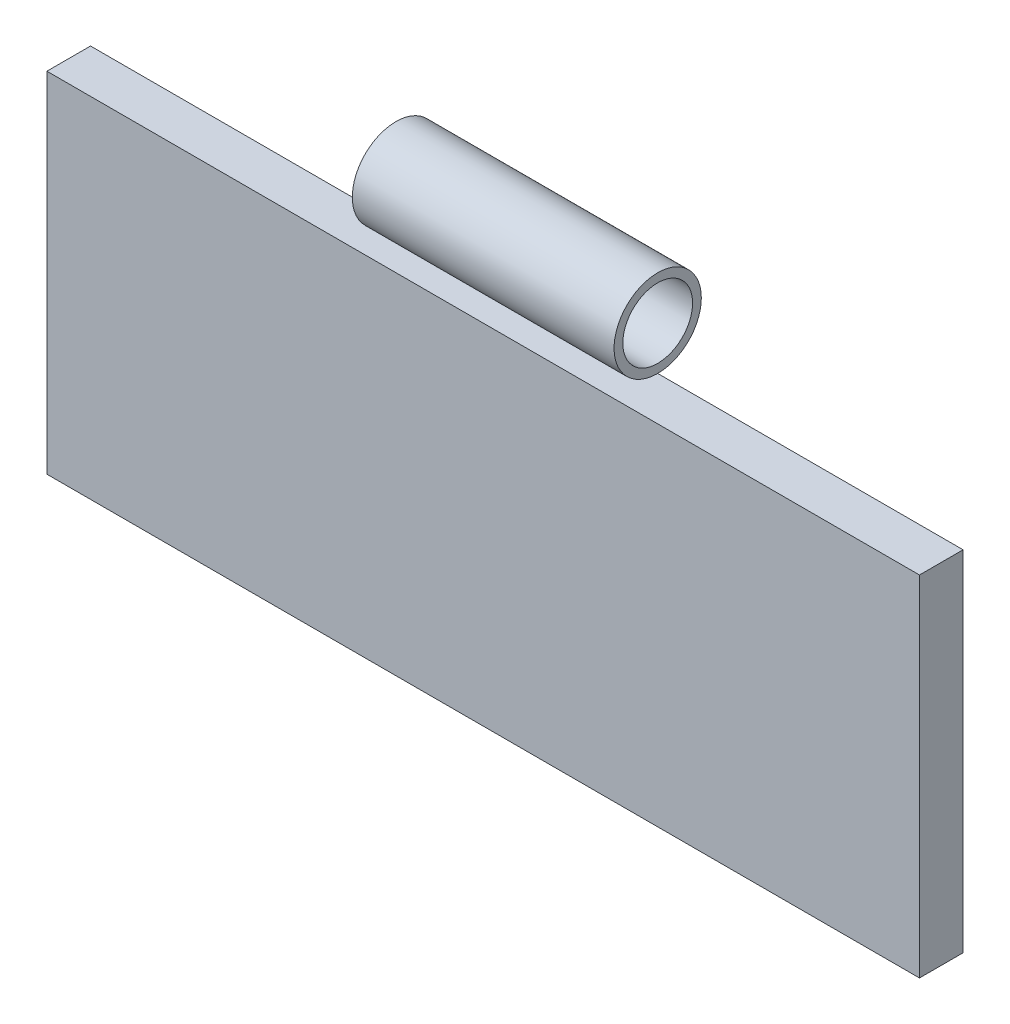
ISO-10303-21;
HEADER;
FILE_DESCRIPTION(('STEP AP214'),'2;1');
FILE_NAME('part.step','',(''),(''),'','','');
FILE_SCHEMA(('AUTOMOTIVE_DESIGN { 1 0 10303 214 1 1 1 1 }'));
ENDSEC;
DATA;
#1=APPLICATION_CONTEXT('core data for automotive mechanical design processes');
#2=APPLICATION_PROTOCOL_DEFINITION('international standard','automotive_design',2000,#1);
#3=PRODUCT_CONTEXT('',#1,'mechanical');
#4=PRODUCT('Part','Part','',(#3));
#5=PRODUCT_RELATED_PRODUCT_CATEGORY('part','',(#4));
#6=PRODUCT_DEFINITION_FORMATION('','',#4);
#7=PRODUCT_DEFINITION_CONTEXT('part definition',#1,'design');
#8=PRODUCT_DEFINITION('design','',#6,#7);
#9=PRODUCT_DEFINITION_SHAPE('','',#8);
#10=(LENGTH_UNIT() NAMED_UNIT(*) SI_UNIT(.MILLI.,.METRE.));
#11=(NAMED_UNIT(*) PLANE_ANGLE_UNIT() SI_UNIT($,.RADIAN.));
#12=(NAMED_UNIT(*) SI_UNIT($,.STERADIAN.) SOLID_ANGLE_UNIT());
#13=UNCERTAINTY_MEASURE_WITH_UNIT(LENGTH_MEASURE(1.E-05),#10,'distance_accuracy_value','');
#14=(GEOMETRIC_REPRESENTATION_CONTEXT(3) GLOBAL_UNCERTAINTY_ASSIGNED_CONTEXT((#13)) GLOBAL_UNIT_ASSIGNED_CONTEXT((#10,
#11,#12)) REPRESENTATION_CONTEXT('',''));
#15=CARTESIAN_POINT('',(0.,0.,0.));
#16=DIRECTION('',(0.,0.,1.));
#17=DIRECTION('',(1.,0.,0.));
#18=AXIS2_PLACEMENT_3D('',#15,#16,#17);
#19=CARTESIAN_POINT('',(15.,25.,0.));
#20=DIRECTION('',(1.,0.,0.));
#21=DIRECTION('',(0.,0.,-1.));
#22=AXIS2_PLACEMENT_3D('',#19,#20,#21);
#23=CYLINDRICAL_SURFACE('',#22,5.);
#24=CARTESIAN_POINT('',(-15.,25.,0.));
#25=DIRECTION('',(1.,0.,0.));
#26=DIRECTION('',(0.,0.,-1.));
#27=AXIS2_PLACEMENT_3D('',#24,#25,#26);
#28=CIRCLE('',#27,5.);
#29=CARTESIAN_POINT('',(-15.,25.,-5.));
#30=VERTEX_POINT('',#29);
#31=EDGE_CURVE('E49',#30,#30,#28,.T.);
#32=ORIENTED_EDGE('',*,*,#31,.T.);
#33=EDGE_LOOP('',(#32));
#34=FACE_BOUND('',#33,.T.);
#35=CARTESIAN_POINT('',(15.,25.,0.));
#36=DIRECTION('',(1.,0.,0.));
#37=DIRECTION('',(0.,0.,-1.));
#38=AXIS2_PLACEMENT_3D('',#35,#36,#37);
#39=CIRCLE('',#38,5.);
#40=CARTESIAN_POINT('',(15.,25.,-5.));
#41=VERTEX_POINT('',#40);
#42=EDGE_CURVE('E11',#41,#41,#39,.T.);
#43=ORIENTED_EDGE('',*,*,#42,.F.);
#44=EDGE_LOOP('',(#43));
#45=FACE_BOUND('',#44,.T.);
#46=ADVANCED_FACE('F43',(#34,#45),#23,.T.);
#47=CARTESIAN_POINT('',(15.,20.,0.));
#48=DIRECTION('',(-1.,0.,0.));
#49=DIRECTION('',(0.,0.,1.));
#50=AXIS2_PLACEMENT_3D('',#47,#48,#49);
#51=PLANE('',#50);
#52=CARTESIAN_POINT('',(15.,25.,0.));
#53=DIRECTION('',(-1.,0.,0.));
#54=DIRECTION('',(0.,0.,1.));
#55=AXIS2_PLACEMENT_3D('',#52,#53,#54);
#56=CIRCLE('',#55,4.);
#57=CARTESIAN_POINT('',(15.,25.,4.));
#58=VERTEX_POINT('',#57);
#59=EDGE_CURVE('E53',#58,#58,#56,.F.);
#60=ORIENTED_EDGE('',*,*,#59,.F.);
#61=EDGE_LOOP('',(#60));
#62=FACE_BOUND('',#61,.T.);
#63=ORIENTED_EDGE('',*,*,#42,.T.);
#64=EDGE_LOOP('',(#63));
#65=FACE_BOUND('',#64,.T.);
#66=ADVANCED_FACE('F69',(#62,#65),#51,.F.);
#67=CARTESIAN_POINT('',(-15.,25.,0.));
#68=DIRECTION('',(1.,0.,0.));
#69=DIRECTION('',(0.,0.,-1.));
#70=AXIS2_PLACEMENT_3D('',#67,#68,#69);
#71=PLANE('',#70);
#72=CARTESIAN_POINT('',(-15.,25.,0.));
#73=DIRECTION('',(-1.,0.,0.));
#74=DIRECTION('',(0.,0.,1.));
#75=AXIS2_PLACEMENT_3D('',#72,#73,#74);
#76=CIRCLE('',#75,4.);
#77=CARTESIAN_POINT('',(-15.,25.,4.));
#78=VERTEX_POINT('',#77);
#79=EDGE_CURVE('E57',#78,#78,#76,.T.);
#80=ORIENTED_EDGE('',*,*,#79,.F.);
#81=EDGE_LOOP('',(#80));
#82=FACE_BOUND('',#81,.T.);
#83=ORIENTED_EDGE('',*,*,#31,.F.);
#84=EDGE_LOOP('',(#83));
#85=FACE_BOUND('',#84,.T.);
#86=ADVANCED_FACE('F66',(#82,#85),#71,.F.);
#87=CARTESIAN_POINT('',(50.001,25.,0.));
#88=DIRECTION('',(-1.,0.,0.));
#89=DIRECTION('',(0.,0.,1.));
#90=AXIS2_PLACEMENT_3D('',#87,#88,#89);
#91=CYLINDRICAL_SURFACE('',#90,4.);
#92=ORIENTED_EDGE('',*,*,#79,.T.);
#93=EDGE_LOOP('',(#92));
#94=FACE_BOUND('',#93,.T.);
#95=ORIENTED_EDGE('',*,*,#59,.T.);
#96=EDGE_LOOP('',(#95));
#97=FACE_BOUND('',#96,.T.);
#98=ADVANCED_FACE('F63',(#94,#97),#91,.F.);
#99=CLOSED_SHELL('',(#46,#66,#86,#98));
#100=MANIFOLD_SOLID_BREP('B2',#99);
#101=CARTESIAN_POINT('',(50.,20.,5.));
#102=DIRECTION('',(-1.,0.,0.));
#103=DIRECTION('',(0.,0.,1.));
#104=AXIS2_PLACEMENT_3D('',#101,#102,#103);
#105=PLANE('',#104);
#106=DIRECTION('',(0.,1.,0.));
#107=VECTOR('',#106,1.);
#108=CARTESIAN_POINT('',(50.,20.,0.));
#109=LINE('',#108,#107);
#110=CARTESIAN_POINT('',(50.,-20.,0.));
#111=VERTEX_POINT('',#110);
#112=CARTESIAN_POINT('',(50.,20.,0.));
#113=VERTEX_POINT('',#112);
#114=EDGE_CURVE('E168',#111,#113,#109,.T.);
#115=ORIENTED_EDGE('',*,*,#114,.T.);
#116=DIRECTION('',(0.,0.,-1.));
#117=VECTOR('',#116,1.);
#118=CARTESIAN_POINT('',(50.,20.,5.));
#119=LINE('',#118,#117);
#120=CARTESIAN_POINT('',(50.,20.,5.));
#121=VERTEX_POINT('',#120);
#122=EDGE_CURVE('E41',#121,#113,#119,.T.);
#123=ORIENTED_EDGE('',*,*,#122,.F.);
#124=DIRECTION('',(0.,1.,0.));
#125=VECTOR('',#124,1.);
#126=CARTESIAN_POINT('',(50.,20.,5.));
#127=LINE('',#126,#125);
#128=CARTESIAN_POINT('',(50.,-20.,5.));
#129=VERTEX_POINT('',#128);
#130=EDGE_CURVE('E156',#129,#121,#127,.T.);
#131=ORIENTED_EDGE('',*,*,#130,.F.);
#132=DIRECTION('',(0.,0.,-1.));
#133=VECTOR('',#132,1.);
#134=CARTESIAN_POINT('',(50.,-20.,5.));
#135=LINE('',#134,#133);
#136=EDGE_CURVE('E164',#129,#111,#135,.T.);
#137=ORIENTED_EDGE('',*,*,#136,.T.);
#138=EDGE_LOOP('',(#115,#123,#131,#137));
#139=FACE_BOUND('',#138,.T.);
#140=ADVANCED_FACE('F105',(#139),#105,.F.);
#141=CARTESIAN_POINT('',(-50.,20.,5.));
#142=DIRECTION('',(0.,-1.,0.));
#143=DIRECTION('',(0.,0.,-1.));
#144=AXIS2_PLACEMENT_3D('',#141,#142,#143);
#145=PLANE('',#144);
#146=DIRECTION('',(-1.,0.,0.));
#147=VECTOR('',#146,1.);
#148=CARTESIAN_POINT('',(-50.,20.,0.));
#149=LINE('',#148,#147);
#150=CARTESIAN_POINT('',(-50.,20.,0.));
#151=VERTEX_POINT('',#150);
#152=EDGE_CURVE('E160',#113,#151,#149,.T.);
#153=ORIENTED_EDGE('',*,*,#152,.T.);
#154=DIRECTION('',(0.,0.,-1.));
#155=VECTOR('',#154,1.);
#156=CARTESIAN_POINT('',(-50.,20.,5.));
#157=LINE('',#156,#155);
#158=CARTESIAN_POINT('',(-50.,20.,5.));
#159=VERTEX_POINT('',#158);
#160=EDGE_CURVE('E113',#159,#151,#157,.T.);
#161=ORIENTED_EDGE('',*,*,#160,.F.);
#162=DIRECTION('',(-1.,0.,0.));
#163=VECTOR('',#162,1.);
#164=CARTESIAN_POINT('',(-50.,20.,5.));
#165=LINE('',#164,#163);
#166=EDGE_CURVE('E151',#121,#159,#165,.T.);
#167=ORIENTED_EDGE('',*,*,#166,.F.);
#168=ORIENTED_EDGE('',*,*,#122,.T.);
#169=EDGE_LOOP('',(#153,#161,#167,#168));
#170=FACE_BOUND('',#169,.T.);
#171=ADVANCED_FACE('F159',(#170),#145,.F.);
#172=CARTESIAN_POINT('',(-50.,20.,5.));
#173=DIRECTION('',(1.,0.,0.));
#174=DIRECTION('',(0.,0.,-1.));
#175=AXIS2_PLACEMENT_3D('',#172,#173,#174);
#176=PLANE('',#175);
#177=DIRECTION('',(0.,-1.,0.));
#178=VECTOR('',#177,1.);
#179=CARTESIAN_POINT('',(-50.,20.,0.));
#180=LINE('',#179,#178);
#181=CARTESIAN_POINT('',(-50.,-20.,0.));
#182=VERTEX_POINT('',#181);
#183=EDGE_CURVE('E138',#151,#182,#180,.T.);
#184=ORIENTED_EDGE('',*,*,#183,.T.);
#185=DIRECTION('',(0.,0.,-1.));
#186=VECTOR('',#185,1.);
#187=CARTESIAN_POINT('',(-50.,-20.,5.));
#188=LINE('',#187,#186);
#189=CARTESIAN_POINT('',(-50.,-20.,5.));
#190=VERTEX_POINT('',#189);
#191=EDGE_CURVE('E161',#190,#182,#188,.T.);
#192=ORIENTED_EDGE('',*,*,#191,.F.);
#193=DIRECTION('',(0.,-1.,0.));
#194=VECTOR('',#193,1.);
#195=CARTESIAN_POINT('',(-50.,20.,5.));
#196=LINE('',#195,#194);
#197=EDGE_CURVE('E154',#159,#190,#196,.T.);
#198=ORIENTED_EDGE('',*,*,#197,.F.);
#199=ORIENTED_EDGE('',*,*,#160,.T.);
#200=EDGE_LOOP('',(#184,#192,#198,#199));
#201=FACE_BOUND('',#200,.T.);
#202=ADVANCED_FACE('F162',(#201),#176,.F.);
#203=CARTESIAN_POINT('',(-50.,-20.,5.));
#204=DIRECTION('',(0.,1.,0.));
#205=DIRECTION('',(0.,0.,1.));
#206=AXIS2_PLACEMENT_3D('',#203,#204,#205);
#207=PLANE('',#206);
#208=DIRECTION('',(1.,0.,0.));
#209=VECTOR('',#208,1.);
#210=CARTESIAN_POINT('',(-50.,-20.,0.));
#211=LINE('',#210,#209);
#212=EDGE_CURVE('E144',#182,#111,#211,.T.);
#213=ORIENTED_EDGE('',*,*,#212,.T.);
#214=ORIENTED_EDGE('',*,*,#136,.F.);
#215=DIRECTION('',(1.,0.,0.));
#216=VECTOR('',#215,1.);
#217=CARTESIAN_POINT('',(-50.,-20.,5.));
#218=LINE('',#217,#216);
#219=EDGE_CURVE('E121',#190,#129,#218,.T.);
#220=ORIENTED_EDGE('',*,*,#219,.F.);
#221=ORIENTED_EDGE('',*,*,#191,.T.);
#222=EDGE_LOOP('',(#213,#214,#220,#221));
#223=FACE_BOUND('',#222,.T.);
#224=ADVANCED_FACE('F175',(#223),#207,.F.);
#225=CARTESIAN_POINT('',(0.,0.,5.));
#226=DIRECTION('',(0.,0.,1.));
#227=DIRECTION('',(1.,0.,0.));
#228=AXIS2_PLACEMENT_3D('',#225,#226,#227);
#229=PLANE('',#228);
#230=ORIENTED_EDGE('',*,*,#130,.T.);
#231=ORIENTED_EDGE('',*,*,#166,.T.);
#232=ORIENTED_EDGE('',*,*,#197,.T.);
#233=ORIENTED_EDGE('',*,*,#219,.T.);
#234=EDGE_LOOP('',(#230,#231,#232,#233));
#235=FACE_BOUND('',#234,.T.);
#236=ADVANCED_FACE('F152',(#235),#229,.T.);
#237=CARTESIAN_POINT('',(0.,0.,0.));
#238=DIRECTION('',(0.,0.,1.));
#239=DIRECTION('',(1.,0.,0.));
#240=AXIS2_PLACEMENT_3D('',#237,#238,#239);
#241=PLANE('',#240);
#242=ORIENTED_EDGE('',*,*,#114,.F.);
#243=ORIENTED_EDGE('',*,*,#212,.F.);
#244=ORIENTED_EDGE('',*,*,#183,.F.);
#245=ORIENTED_EDGE('',*,*,#152,.F.);
#246=EDGE_LOOP('',(#242,#243,#244,#245));
#247=FACE_BOUND('',#246,.T.);
#248=ADVANCED_FACE('F178',(#247),#241,.F.);
#249=CLOSED_SHELL('',(#140,#171,#202,#224,#236,#248));
#250=MANIFOLD_SOLID_BREP('B6',#249);
#251=ADVANCED_BREP_SHAPE_REPRESENTATION('',(#18,#100,#250),#14);
#252=SHAPE_DEFINITION_REPRESENTATION(#9,#251);
ENDSEC;
END-ISO-10303-21;
